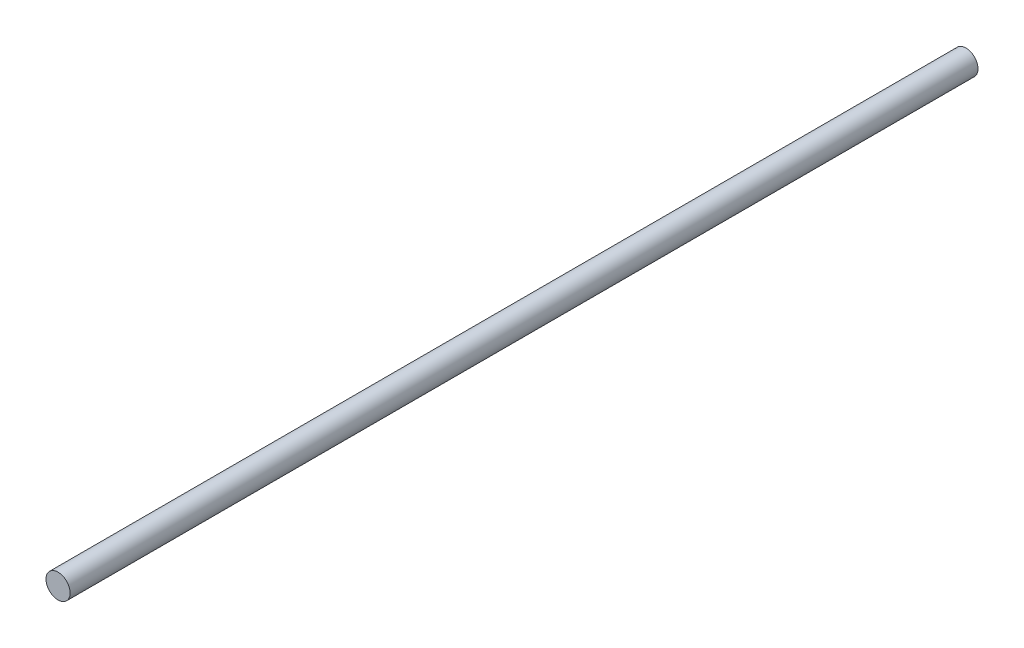
ISO-10303-21;
HEADER;
FILE_DESCRIPTION(('STEP AP214'),'2;1');
FILE_NAME('part.step','',(''),(''),'','','');
FILE_SCHEMA(('AUTOMOTIVE_DESIGN { 1 0 10303 214 1 1 1 1 }'));
ENDSEC;
DATA;
#1=APPLICATION_CONTEXT('core data for automotive mechanical design processes');
#2=APPLICATION_PROTOCOL_DEFINITION('international standard','automotive_design',2000,#1);
#3=PRODUCT_CONTEXT('',#1,'mechanical');
#4=PRODUCT('Part','Part','',(#3));
#5=PRODUCT_RELATED_PRODUCT_CATEGORY('part','',(#4));
#6=PRODUCT_DEFINITION_FORMATION('','',#4);
#7=PRODUCT_DEFINITION_CONTEXT('part definition',#1,'design');
#8=PRODUCT_DEFINITION('design','',#6,#7);
#9=PRODUCT_DEFINITION_SHAPE('','',#8);
#10=(LENGTH_UNIT() NAMED_UNIT(*) SI_UNIT(.MILLI.,.METRE.));
#11=(NAMED_UNIT(*) PLANE_ANGLE_UNIT() SI_UNIT($,.RADIAN.));
#12=(NAMED_UNIT(*) SI_UNIT($,.STERADIAN.) SOLID_ANGLE_UNIT());
#13=UNCERTAINTY_MEASURE_WITH_UNIT(LENGTH_MEASURE(1.E-05),#10,'distance_accuracy_value','');
#14=(GEOMETRIC_REPRESENTATION_CONTEXT(3) GLOBAL_UNCERTAINTY_ASSIGNED_CONTEXT((#13)) GLOBAL_UNIT_ASSIGNED_CONTEXT((#10,
#11,#12)) REPRESENTATION_CONTEXT('',''));
#15=CARTESIAN_POINT('',(0.,0.,0.));
#16=DIRECTION('',(0.,0.,1.));
#17=DIRECTION('',(1.,0.,0.));
#18=AXIS2_PLACEMENT_3D('',#15,#16,#17);
#19=CARTESIAN_POINT('',(0.,0.,-94.));
#20=DIRECTION('',(0.,0.,1.));
#21=DIRECTION('',(1.,0.,0.));
#22=AXIS2_PLACEMENT_3D('',#19,#20,#21);
#23=CYLINDRICAL_SURFACE('',#22,1.25);
#24=CARTESIAN_POINT('',(0.,0.,-94.));
#25=DIRECTION('',(0.,0.,1.));
#26=DIRECTION('',(1.,0.,0.));
#27=AXIS2_PLACEMENT_3D('',#24,#25,#26);
#28=CIRCLE('',#27,1.25);
#29=CARTESIAN_POINT('',(1.25,0.,-94.));
#30=VERTEX_POINT('',#29);
#31=EDGE_CURVE('E10',#30,#30,#28,.T.);
#32=ORIENTED_EDGE('',*,*,#31,.T.);
#33=EDGE_LOOP('',(#32));
#34=FACE_BOUND('',#33,.T.);
#35=CARTESIAN_POINT('',(0.,0.,0.));
#36=DIRECTION('',(0.,0.,1.));
#37=DIRECTION('',(1.,0.,0.));
#38=AXIS2_PLACEMENT_3D('',#35,#36,#37);
#39=CIRCLE('',#38,1.25);
#40=CARTESIAN_POINT('',(1.25,0.,0.));
#41=VERTEX_POINT('',#40);
#42=EDGE_CURVE('E42',#41,#41,#39,.T.);
#43=ORIENTED_EDGE('',*,*,#42,.F.);
#44=EDGE_LOOP('',(#43));
#45=FACE_BOUND('',#44,.T.);
#46=ADVANCED_FACE('F39',(#34,#45),#23,.T.);
#47=CARTESIAN_POINT('',(0.,0.,-94.));
#48=DIRECTION('',(0.,0.,1.));
#49=DIRECTION('',(1.,0.,0.));
#50=AXIS2_PLACEMENT_3D('',#47,#48,#49);
#51=PLANE('',#50);
#52=ORIENTED_EDGE('',*,*,#31,.F.);
#53=EDGE_LOOP('',(#52));
#54=FACE_BOUND('',#53,.T.);
#55=ADVANCED_FACE('F54',(#54),#51,.F.);
#56=CARTESIAN_POINT('',(0.,0.,0.));
#57=DIRECTION('',(0.,0.,1.));
#58=DIRECTION('',(1.,0.,0.));
#59=AXIS2_PLACEMENT_3D('',#56,#57,#58);
#60=PLANE('',#59);
#61=ORIENTED_EDGE('',*,*,#42,.T.);
#62=EDGE_LOOP('',(#61));
#63=FACE_BOUND('',#62,.T.);
#64=ADVANCED_FACE('F51',(#63),#60,.T.);
#65=CLOSED_SHELL('',(#46,#55,#64));
#66=MANIFOLD_SOLID_BREP('B2',#65);
#67=ADVANCED_BREP_SHAPE_REPRESENTATION('',(#18,#66),#14);
#68=SHAPE_DEFINITION_REPRESENTATION(#9,#67);
ENDSEC;
END-ISO-10303-21;
